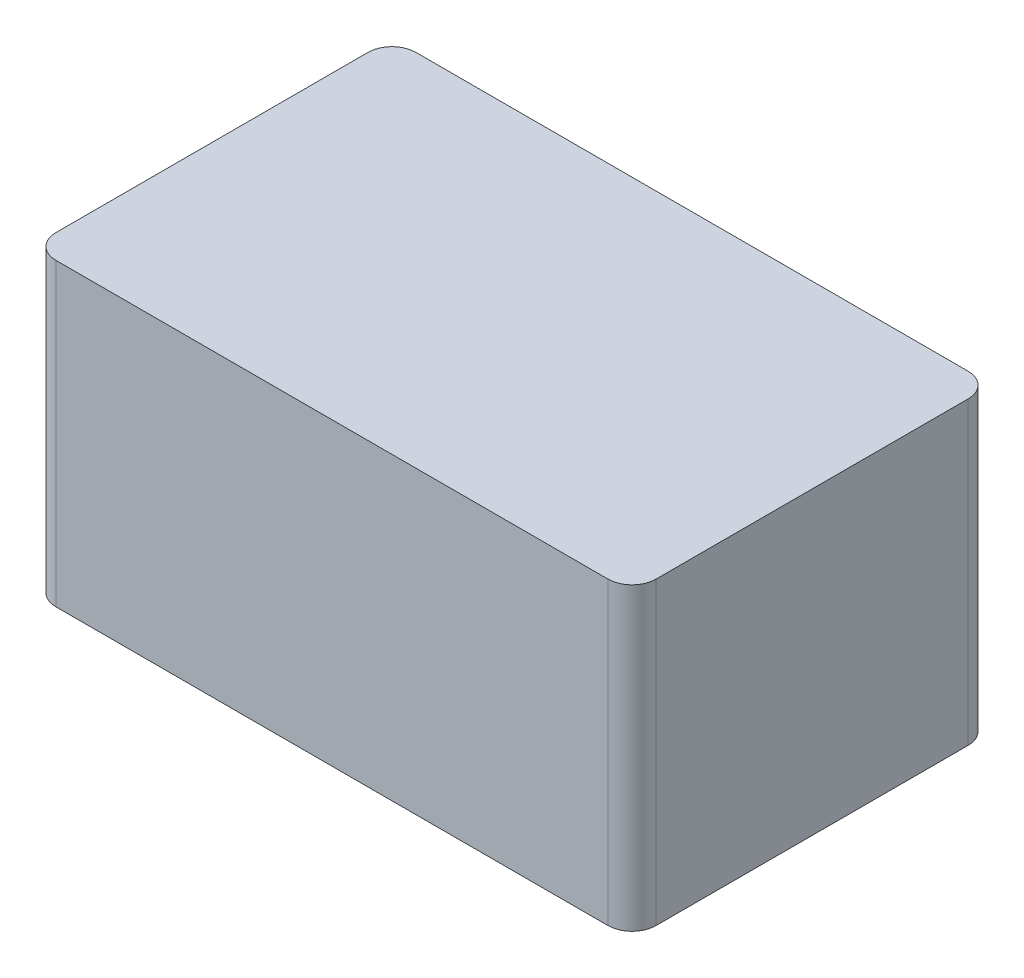
ISO-10303-21;
HEADER;
FILE_DESCRIPTION(('STEP AP214'),'2;1');
FILE_NAME('part.step','',(''),(''),'','','');
FILE_SCHEMA(('AUTOMOTIVE_DESIGN { 1 0 10303 214 1 1 1 1 }'));
ENDSEC;
DATA;
#1=APPLICATION_CONTEXT('core data for automotive mechanical design processes');
#2=APPLICATION_PROTOCOL_DEFINITION('international standard','automotive_design',2000,#1);
#3=PRODUCT_CONTEXT('',#1,'mechanical');
#4=PRODUCT('Part','Part','',(#3));
#5=PRODUCT_RELATED_PRODUCT_CATEGORY('part','',(#4));
#6=PRODUCT_DEFINITION_FORMATION('','',#4);
#7=PRODUCT_DEFINITION_CONTEXT('part definition',#1,'design');
#8=PRODUCT_DEFINITION('design','',#6,#7);
#9=PRODUCT_DEFINITION_SHAPE('','',#8);
#10=(LENGTH_UNIT() NAMED_UNIT(*) SI_UNIT(.MILLI.,.METRE.));
#11=(NAMED_UNIT(*) PLANE_ANGLE_UNIT() SI_UNIT($,.RADIAN.));
#12=(NAMED_UNIT(*) SI_UNIT($,.STERADIAN.) SOLID_ANGLE_UNIT());
#13=UNCERTAINTY_MEASURE_WITH_UNIT(LENGTH_MEASURE(1.E-05),#10,'distance_accuracy_value','');
#14=(GEOMETRIC_REPRESENTATION_CONTEXT(3) GLOBAL_UNCERTAINTY_ASSIGNED_CONTEXT((#13)) GLOBAL_UNIT_ASSIGNED_CONTEXT((#10,
#11,#12)) REPRESENTATION_CONTEXT('',''));
#15=CARTESIAN_POINT('',(0.,0.,0.));
#16=DIRECTION('',(0.,0.,1.));
#17=DIRECTION('',(1.,0.,0.));
#18=AXIS2_PLACEMENT_3D('',#15,#16,#17);
#19=CARTESIAN_POINT('',(-25.,25.,15.));
#20=DIRECTION('',(1.,0.,0.));
#21=DIRECTION('',(0.,0.,-1.));
#22=AXIS2_PLACEMENT_3D('',#19,#20,#21);
#23=PLANE('',#22);
#24=DIRECTION('',(0.,0.,1.));
#25=VECTOR('',#24,1.);
#26=CARTESIAN_POINT('',(-25.,25.,15.));
#27=LINE('',#26,#25);
#28=CARTESIAN_POINT('',(-25.,25.,-13.));
#29=VERTEX_POINT('',#28);
#30=CARTESIAN_POINT('',(-25.,25.,13.));
#31=VERTEX_POINT('',#30);
#32=EDGE_CURVE('E118',#29,#31,#27,.T.);
#33=ORIENTED_EDGE('',*,*,#32,.F.);
#34=DIRECTION('',(0.,-1.,0.));
#35=VECTOR('',#34,1.);
#36=CARTESIAN_POINT('',(-25.,25.,-13.));
#37=LINE('',#36,#35);
#38=CARTESIAN_POINT('',(-25.,0.,-13.));
#39=VERTEX_POINT('',#38);
#40=EDGE_CURVE('E103',#29,#39,#37,.T.);
#41=ORIENTED_EDGE('',*,*,#40,.T.);
#42=DIRECTION('',(0.,0.,1.));
#43=VECTOR('',#42,1.);
#44=CARTESIAN_POINT('',(-25.,0.,15.));
#45=LINE('',#44,#43);
#46=CARTESIAN_POINT('',(-25.,0.,13.));
#47=VERTEX_POINT('',#46);
#48=EDGE_CURVE('E115',#39,#47,#45,.T.);
#49=ORIENTED_EDGE('',*,*,#48,.T.);
#50=DIRECTION('',(0.,-1.,0.));
#51=VECTOR('',#50,1.);
#52=CARTESIAN_POINT('',(-25.,25.,13.));
#53=LINE('',#52,#51);
#54=EDGE_CURVE('E120',#47,#31,#53,.F.);
#55=ORIENTED_EDGE('',*,*,#54,.T.);
#56=EDGE_LOOP('',(#33,#41,#49,#55));
#57=FACE_BOUND('',#56,.T.);
#58=ADVANCED_FACE('F34',(#57),#23,.F.);
#59=CARTESIAN_POINT('',(25.,25.,15.));
#60=DIRECTION('',(0.,0.,-1.));
#61=DIRECTION('',(-1.,0.,0.));
#62=AXIS2_PLACEMENT_3D('',#59,#60,#61);
#63=PLANE('',#62);
#64=DIRECTION('',(1.,0.,0.));
#65=VECTOR('',#64,1.);
#66=CARTESIAN_POINT('',(25.,25.,15.));
#67=LINE('',#66,#65);
#68=CARTESIAN_POINT('',(-23.,25.,15.));
#69=VERTEX_POINT('',#68);
#70=CARTESIAN_POINT('',(23.,25.,15.));
#71=VERTEX_POINT('',#70);
#72=EDGE_CURVE('E169',#69,#71,#67,.T.);
#73=ORIENTED_EDGE('',*,*,#72,.F.);
#74=DIRECTION('',(0.,-1.,0.));
#75=VECTOR('',#74,1.);
#76=CARTESIAN_POINT('',(-23.,25.,15.));
#77=LINE('',#76,#75);
#78=CARTESIAN_POINT('',(-23.,0.,15.));
#79=VERTEX_POINT('',#78);
#80=EDGE_CURVE('E153',#69,#79,#77,.T.);
#81=ORIENTED_EDGE('',*,*,#80,.T.);
#82=DIRECTION('',(1.,0.,0.));
#83=VECTOR('',#82,1.);
#84=CARTESIAN_POINT('',(25.,0.,15.));
#85=LINE('',#84,#83);
#86=CARTESIAN_POINT('',(23.,0.,15.));
#87=VERTEX_POINT('',#86);
#88=EDGE_CURVE('E124',#79,#87,#85,.T.);
#89=ORIENTED_EDGE('',*,*,#88,.T.);
#90=DIRECTION('',(0.,-1.,0.));
#91=VECTOR('',#90,1.);
#92=CARTESIAN_POINT('',(23.,25.,15.));
#93=LINE('',#92,#91);
#94=EDGE_CURVE('E151',#87,#71,#93,.F.);
#95=ORIENTED_EDGE('',*,*,#94,.T.);
#96=EDGE_LOOP('',(#73,#81,#89,#95));
#97=FACE_BOUND('',#96,.T.);
#98=ADVANCED_FACE('F179',(#97),#63,.F.);
#99=CARTESIAN_POINT('',(25.,25.,15.));
#100=DIRECTION('',(-1.,0.,0.));
#101=DIRECTION('',(0.,0.,1.));
#102=AXIS2_PLACEMENT_3D('',#99,#100,#101);
#103=PLANE('',#102);
#104=DIRECTION('',(0.,0.,-1.));
#105=VECTOR('',#104,1.);
#106=CARTESIAN_POINT('',(25.,0.,15.));
#107=LINE('',#106,#105);
#108=CARTESIAN_POINT('',(25.,0.,13.));
#109=VERTEX_POINT('',#108);
#110=CARTESIAN_POINT('',(25.,0.,-13.));
#111=VERTEX_POINT('',#110);
#112=EDGE_CURVE('E127',#109,#111,#107,.T.);
#113=ORIENTED_EDGE('',*,*,#112,.T.);
#114=DIRECTION('',(0.,-1.,0.));
#115=VECTOR('',#114,1.);
#116=CARTESIAN_POINT('',(25.,25.,-13.));
#117=LINE('',#116,#115);
#118=CARTESIAN_POINT('',(25.,25.,-13.));
#119=VERTEX_POINT('',#118);
#120=EDGE_CURVE('E11',#111,#119,#117,.F.);
#121=ORIENTED_EDGE('',*,*,#120,.T.);
#122=DIRECTION('',(0.,0.,-1.));
#123=VECTOR('',#122,1.);
#124=CARTESIAN_POINT('',(25.,25.,15.));
#125=LINE('',#124,#123);
#126=CARTESIAN_POINT('',(25.,25.,13.));
#127=VERTEX_POINT('',#126);
#128=EDGE_CURVE('E159',#127,#119,#125,.T.);
#129=ORIENTED_EDGE('',*,*,#128,.F.);
#130=DIRECTION('',(0.,-1.,0.));
#131=VECTOR('',#130,1.);
#132=CARTESIAN_POINT('',(25.,25.,13.));
#133=LINE('',#132,#131);
#134=EDGE_CURVE('E42',#127,#109,#133,.T.);
#135=ORIENTED_EDGE('',*,*,#134,.T.);
#136=EDGE_LOOP('',(#113,#121,#129,#135));
#137=FACE_BOUND('',#136,.T.);
#138=ADVANCED_FACE('F158',(#137),#103,.F.);
#139=CARTESIAN_POINT('',(25.,25.,-15.));
#140=DIRECTION('',(0.,0.,1.));
#141=DIRECTION('',(1.,0.,0.));
#142=AXIS2_PLACEMENT_3D('',#139,#140,#141);
#143=PLANE('',#142);
#144=DIRECTION('',(-1.,0.,0.));
#145=VECTOR('',#144,1.);
#146=CARTESIAN_POINT('',(25.,0.,-15.));
#147=LINE('',#146,#145);
#148=CARTESIAN_POINT('',(23.,0.,-15.));
#149=VERTEX_POINT('',#148);
#150=CARTESIAN_POINT('',(-23.,0.,-15.));
#151=VERTEX_POINT('',#150);
#152=EDGE_CURVE('E134',#149,#151,#147,.T.);
#153=ORIENTED_EDGE('',*,*,#152,.T.);
#154=DIRECTION('',(0.,-1.,0.));
#155=VECTOR('',#154,1.);
#156=CARTESIAN_POINT('',(-23.,25.,-15.));
#157=LINE('',#156,#155);
#158=CARTESIAN_POINT('',(-23.,25.,-15.));
#159=VERTEX_POINT('',#158);
#160=EDGE_CURVE('E104',#151,#159,#157,.F.);
#161=ORIENTED_EDGE('',*,*,#160,.T.);
#162=DIRECTION('',(-1.,0.,0.));
#163=VECTOR('',#162,1.);
#164=CARTESIAN_POINT('',(25.,25.,-15.));
#165=LINE('',#164,#163);
#166=CARTESIAN_POINT('',(23.,25.,-15.));
#167=VERTEX_POINT('',#166);
#168=EDGE_CURVE('E130',#167,#159,#165,.T.);
#169=ORIENTED_EDGE('',*,*,#168,.F.);
#170=DIRECTION('',(0.,-1.,0.));
#171=VECTOR('',#170,1.);
#172=CARTESIAN_POINT('',(23.,25.,-15.));
#173=LINE('',#172,#171);
#174=EDGE_CURVE('E109',#167,#149,#173,.T.);
#175=ORIENTED_EDGE('',*,*,#174,.T.);
#176=EDGE_LOOP('',(#153,#161,#169,#175));
#177=FACE_BOUND('',#176,.T.);
#178=ADVANCED_FACE('F167',(#177),#143,.F.);
#179=CARTESIAN_POINT('',(0.,25.,0.));
#180=DIRECTION('',(0.,1.,0.));
#181=DIRECTION('',(0.,0.,1.));
#182=AXIS2_PLACEMENT_3D('',#179,#180,#181);
#183=PLANE('',#182);
#184=ORIENTED_EDGE('',*,*,#168,.T.);
#185=CARTESIAN_POINT('',(-23.,25.,-13.));
#186=DIRECTION('',(0.,1.,0.));
#187=DIRECTION('',(0.,0.,1.));
#188=AXIS2_PLACEMENT_3D('',#185,#186,#187);
#189=CIRCLE('',#188,2.);
#190=EDGE_CURVE('E149',#159,#29,#189,.T.);
#191=ORIENTED_EDGE('',*,*,#190,.T.);
#192=ORIENTED_EDGE('',*,*,#32,.T.);
#193=CARTESIAN_POINT('',(-23.,25.,13.));
#194=DIRECTION('',(0.,1.,0.));
#195=DIRECTION('',(0.,0.,1.));
#196=AXIS2_PLACEMENT_3D('',#193,#194,#195);
#197=CIRCLE('',#196,2.);
#198=EDGE_CURVE('E147',#31,#69,#197,.T.);
#199=ORIENTED_EDGE('',*,*,#198,.T.);
#200=ORIENTED_EDGE('',*,*,#72,.T.);
#201=CARTESIAN_POINT('',(23.,25.,13.));
#202=DIRECTION('',(0.,1.,0.));
#203=DIRECTION('',(0.,0.,1.));
#204=AXIS2_PLACEMENT_3D('',#201,#202,#203);
#205=CIRCLE('',#204,2.);
#206=EDGE_CURVE('E54',#71,#127,#205,.T.);
#207=ORIENTED_EDGE('',*,*,#206,.T.);
#208=ORIENTED_EDGE('',*,*,#128,.T.);
#209=CARTESIAN_POINT('',(23.,25.,-13.));
#210=DIRECTION('',(0.,1.,0.));
#211=DIRECTION('',(0.,0.,1.));
#212=AXIS2_PLACEMENT_3D('',#209,#210,#211);
#213=CIRCLE('',#212,2.);
#214=EDGE_CURVE('E145',#119,#167,#213,.T.);
#215=ORIENTED_EDGE('',*,*,#214,.T.);
#216=EDGE_LOOP('',(#184,#191,#192,#199,#200,#207,#208,#215));
#217=FACE_BOUND('',#216,.T.);
#218=ADVANCED_FACE('F173',(#217),#183,.T.);
#219=CARTESIAN_POINT('',(0.,0.,0.));
#220=DIRECTION('',(0.,1.,0.));
#221=DIRECTION('',(0.,0.,1.));
#222=AXIS2_PLACEMENT_3D('',#219,#220,#221);
#223=PLANE('',#222);
#224=ORIENTED_EDGE('',*,*,#48,.F.);
#225=CARTESIAN_POINT('',(-23.,0.,-13.));
#226=DIRECTION('',(0.,1.,0.));
#227=DIRECTION('',(0.,0.,1.));
#228=AXIS2_PLACEMENT_3D('',#225,#226,#227);
#229=CIRCLE('',#228,2.);
#230=EDGE_CURVE('E99',#39,#151,#229,.F.);
#231=ORIENTED_EDGE('',*,*,#230,.T.);
#232=ORIENTED_EDGE('',*,*,#152,.F.);
#233=CARTESIAN_POINT('',(23.,0.,-13.));
#234=DIRECTION('',(0.,1.,0.));
#235=DIRECTION('',(0.,0.,1.));
#236=AXIS2_PLACEMENT_3D('',#233,#234,#235);
#237=CIRCLE('',#236,2.);
#238=EDGE_CURVE('E138',#149,#111,#237,.F.);
#239=ORIENTED_EDGE('',*,*,#238,.T.);
#240=ORIENTED_EDGE('',*,*,#112,.F.);
#241=CARTESIAN_POINT('',(23.,0.,13.));
#242=DIRECTION('',(0.,1.,0.));
#243=DIRECTION('',(0.,0.,1.));
#244=AXIS2_PLACEMENT_3D('',#241,#242,#243);
#245=CIRCLE('',#244,2.);
#246=EDGE_CURVE('E119',#109,#87,#245,.F.);
#247=ORIENTED_EDGE('',*,*,#246,.T.);
#248=ORIENTED_EDGE('',*,*,#88,.F.);
#249=CARTESIAN_POINT('',(-23.,0.,13.));
#250=DIRECTION('',(0.,1.,0.));
#251=DIRECTION('',(0.,0.,1.));
#252=AXIS2_PLACEMENT_3D('',#249,#250,#251);
#253=CIRCLE('',#252,2.);
#254=EDGE_CURVE('E110',#79,#47,#253,.F.);
#255=ORIENTED_EDGE('',*,*,#254,.T.);
#256=EDGE_LOOP('',(#224,#231,#232,#239,#240,#247,#248,#255));
#257=FACE_BOUND('',#256,.T.);
#258=ADVANCED_FACE('F122',(#257),#223,.F.);
#259=CARTESIAN_POINT('',(-23.,25.,-13.));
#260=DIRECTION('',(0.,-1.,0.));
#261=DIRECTION('',(0.,0.,-1.));
#262=AXIS2_PLACEMENT_3D('',#259,#260,#261);
#263=CYLINDRICAL_SURFACE('',#262,2.);
#264=ORIENTED_EDGE('',*,*,#190,.F.);
#265=ORIENTED_EDGE('',*,*,#160,.F.);
#266=ORIENTED_EDGE('',*,*,#230,.F.);
#267=ORIENTED_EDGE('',*,*,#40,.F.);
#268=EDGE_LOOP('',(#264,#265,#266,#267));
#269=FACE_BOUND('',#268,.T.);
#270=ADVANCED_FACE('F102',(#269),#263,.T.);
#271=CARTESIAN_POINT('',(-23.,25.,13.));
#272=DIRECTION('',(0.,-1.,0.));
#273=DIRECTION('',(0.,0.,-1.));
#274=AXIS2_PLACEMENT_3D('',#271,#272,#273);
#275=CYLINDRICAL_SURFACE('',#274,2.);
#276=ORIENTED_EDGE('',*,*,#198,.F.);
#277=ORIENTED_EDGE('',*,*,#54,.F.);
#278=ORIENTED_EDGE('',*,*,#254,.F.);
#279=ORIENTED_EDGE('',*,*,#80,.F.);
#280=EDGE_LOOP('',(#276,#277,#278,#279));
#281=FACE_BOUND('',#280,.T.);
#282=ADVANCED_FACE('F177',(#281),#275,.T.);
#283=CARTESIAN_POINT('',(23.,25.,-13.));
#284=DIRECTION('',(0.,-1.,0.));
#285=DIRECTION('',(0.,0.,-1.));
#286=AXIS2_PLACEMENT_3D('',#283,#284,#285);
#287=CYLINDRICAL_SURFACE('',#286,2.);
#288=ORIENTED_EDGE('',*,*,#214,.F.);
#289=ORIENTED_EDGE('',*,*,#120,.F.);
#290=ORIENTED_EDGE('',*,*,#238,.F.);
#291=ORIENTED_EDGE('',*,*,#174,.F.);
#292=EDGE_LOOP('',(#288,#289,#290,#291));
#293=FACE_BOUND('',#292,.T.);
#294=ADVANCED_FACE('F164',(#293),#287,.T.);
#295=CARTESIAN_POINT('',(23.,25.,13.));
#296=DIRECTION('',(0.,-1.,0.));
#297=DIRECTION('',(0.,0.,-1.));
#298=AXIS2_PLACEMENT_3D('',#295,#296,#297);
#299=CYLINDRICAL_SURFACE('',#298,2.);
#300=ORIENTED_EDGE('',*,*,#206,.F.);
#301=ORIENTED_EDGE('',*,*,#94,.F.);
#302=ORIENTED_EDGE('',*,*,#246,.F.);
#303=ORIENTED_EDGE('',*,*,#134,.F.);
#304=EDGE_LOOP('',(#300,#301,#302,#303));
#305=FACE_BOUND('',#304,.T.);
#306=ADVANCED_FACE('F36',(#305),#299,.T.);
#307=CLOSED_SHELL('',(#58,#98,#138,#178,#218,#258,#270,#282,#294,#306));
#308=MANIFOLD_SOLID_BREP('B2',#307);
#309=ADVANCED_BREP_SHAPE_REPRESENTATION('',(#18,#308),#14);
#310=SHAPE_DEFINITION_REPRESENTATION(#9,#309);
ENDSEC;
END-ISO-10303-21;
